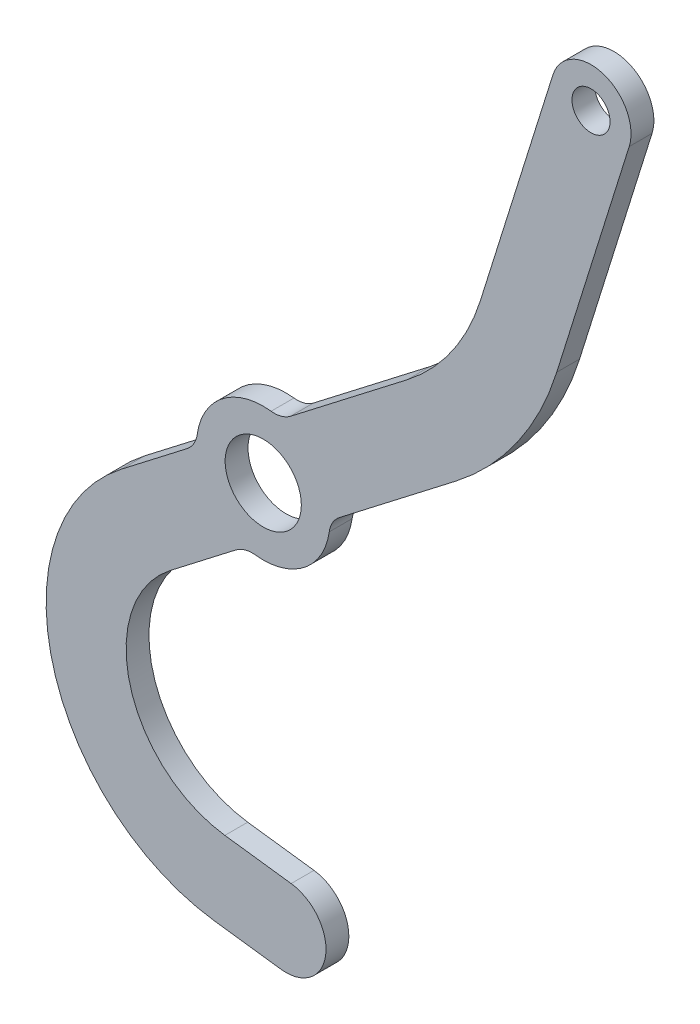
ISO-10303-21;
HEADER;
FILE_DESCRIPTION(('STEP AP214'),'2;1');
FILE_NAME('part.step','',(''),(''),'','','');
FILE_SCHEMA(('AUTOMOTIVE_DESIGN { 1 0 10303 214 1 1 1 1 }'));
ENDSEC;
DATA;
#1=APPLICATION_CONTEXT('core data for automotive mechanical design processes');
#2=APPLICATION_PROTOCOL_DEFINITION('international standard','automotive_design',2000,#1);
#3=PRODUCT_CONTEXT('',#1,'mechanical');
#4=PRODUCT('Part','Part','',(#3));
#5=PRODUCT_RELATED_PRODUCT_CATEGORY('part','',(#4));
#6=PRODUCT_DEFINITION_FORMATION('','',#4);
#7=PRODUCT_DEFINITION_CONTEXT('part definition',#1,'design');
#8=PRODUCT_DEFINITION('design','',#6,#7);
#9=PRODUCT_DEFINITION_SHAPE('','',#8);
#10=(LENGTH_UNIT() NAMED_UNIT(*) SI_UNIT(.MILLI.,.METRE.));
#11=(NAMED_UNIT(*) PLANE_ANGLE_UNIT() SI_UNIT($,.RADIAN.));
#12=(NAMED_UNIT(*) SI_UNIT($,.STERADIAN.) SOLID_ANGLE_UNIT());
#13=UNCERTAINTY_MEASURE_WITH_UNIT(LENGTH_MEASURE(1.E-05),#10,'distance_accuracy_value','');
#14=(GEOMETRIC_REPRESENTATION_CONTEXT(3) GLOBAL_UNCERTAINTY_ASSIGNED_CONTEXT((#13)) GLOBAL_UNIT_ASSIGNED_CONTEXT((#10,
#11,#12)) REPRESENTATION_CONTEXT('',''));
#15=CARTESIAN_POINT('',(0.,0.,0.));
#16=DIRECTION('',(0.,0.,1.));
#17=DIRECTION('',(1.,0.,0.));
#18=AXIS2_PLACEMENT_3D('',#15,#16,#17);
#19=CARTESIAN_POINT('',(33.4833613602103,43.6472773612829,5.78571428571429));
#20=DIRECTION('',(0.,0.,-1.));
#21=DIRECTION('',(-1.,0.,0.));
#22=AXIS2_PLACEMENT_3D('',#19,#20,#21);
#23=CYLINDRICAL_SURFACE('',#22,5.24999999999972);
#24=CARTESIAN_POINT('',(33.4833613602103,43.6472773612829,2.78571428571429));
#25=DIRECTION('',(0.,0.,1.));
#26=DIRECTION('',(-1.,0.,0.));
#27=AXIS2_PLACEMENT_3D('',#24,#25,#26);
#28=CIRCLE('',#27,5.24999999999972);
#29=CARTESIAN_POINT('',(38.4939702359269,42.0800190243824,2.78571428571429));
#30=VERTEX_POINT('',#29);
#31=CARTESIAN_POINT('',(28.4727524844932,45.2145356981836,2.78571428571429));
#32=VERTEX_POINT('',#31);
#33=EDGE_CURVE('E209',#30,#32,#28,.T.);
#34=ORIENTED_EDGE('',*,*,#33,.T.);
#35=DIRECTION('',(0.,0.,-1.));
#36=VECTOR('',#35,1.);
#37=CARTESIAN_POINT('',(28.4727524844932,45.2145356981836,5.78571428571429));
#38=LINE('',#37,#36);
#39=CARTESIAN_POINT('',(28.4727524844932,45.2145356981836,5.78571428571429));
#40=VERTEX_POINT('',#39);
#41=EDGE_CURVE('E11',#40,#32,#38,.T.);
#42=ORIENTED_EDGE('',*,*,#41,.F.);
#43=CARTESIAN_POINT('',(33.4833613602103,43.6472773612829,5.78571428571429));
#44=DIRECTION('',(0.,0.,1.));
#45=DIRECTION('',(-1.,0.,0.));
#46=AXIS2_PLACEMENT_3D('',#43,#44,#45);
#47=CIRCLE('',#46,5.24999999999972);
#48=CARTESIAN_POINT('',(38.4939702359269,42.0800190243824,5.78571428571429));
#49=VERTEX_POINT('',#48);
#50=EDGE_CURVE('E248',#49,#40,#47,.T.);
#51=ORIENTED_EDGE('',*,*,#50,.F.);
#52=DIRECTION('',(0.,0.,-1.));
#53=VECTOR('',#52,1.);
#54=CARTESIAN_POINT('',(38.4939702359269,42.0800190243824,5.78571428571429));
#55=LINE('',#54,#53);
#56=EDGE_CURVE('E205',#49,#30,#55,.T.);
#57=ORIENTED_EDGE('',*,*,#56,.T.);
#58=EDGE_LOOP('',(#34,#42,#51,#57));
#59=FACE_BOUND('',#58,.T.);
#60=ADVANCED_FACE('F41',(#59),#23,.T.);
#61=CARTESIAN_POINT('',(18.9598883272442,14.8013992946073,5.78571428571429));
#62=DIRECTION('',(0.954401690612786,-0.298525397504894,0.));
#63=DIRECTION('',(0.298525397504894,0.954401690612787,0.));
#64=AXIS2_PLACEMENT_3D('',#61,#62,#63);
#65=PLANE('',#64);
#66=DIRECTION('',(-0.298525397504894,-0.954401690612786,0.));
#67=VECTOR('',#66,1.);
#68=CARTESIAN_POINT('',(18.9598883272442,14.8013992946073,2.78571428571429));
#69=LINE('',#68,#67);
#70=CARTESIAN_POINT('',(18.9598883272442,14.8013992946073,2.78571428571429));
#71=VERTEX_POINT('',#70);
#72=EDGE_CURVE('E212',#32,#71,#69,.T.);
#73=ORIENTED_EDGE('',*,*,#72,.T.);
#74=DIRECTION('',(0.,0.,-1.));
#75=VECTOR('',#74,1.);
#76=CARTESIAN_POINT('',(18.9598883272442,14.8013992946073,5.78571428571429));
#77=LINE('',#76,#75);
#78=CARTESIAN_POINT('',(18.9598883272442,14.8013992946073,5.78571428571429));
#79=VERTEX_POINT('',#78);
#80=EDGE_CURVE('E49',#79,#71,#77,.T.);
#81=ORIENTED_EDGE('',*,*,#80,.F.);
#82=DIRECTION('',(-0.298525397504894,-0.954401690612786,0.));
#83=VECTOR('',#82,1.);
#84=CARTESIAN_POINT('',(18.9598883272442,14.8013992946073,5.78571428571429));
#85=LINE('',#84,#83);
#86=EDGE_CURVE('E136',#40,#79,#85,.T.);
#87=ORIENTED_EDGE('',*,*,#86,.F.);
#88=ORIENTED_EDGE('',*,*,#41,.T.);
#89=EDGE_LOOP('',(#73,#81,#87,#88));
#90=FACE_BOUND('',#89,.T.);
#91=ADVANCED_FACE('F367',(#90),#65,.F.);
#92=CARTESIAN_POINT('',(-7.76335900991444,23.1601104247448,5.78571428571429));
#93=DIRECTION('',(0.,0.,-1.));
#94=DIRECTION('',(-1.,0.,0.));
#95=AXIS2_PLACEMENT_3D('',#92,#93,#94);
#96=CYLINDRICAL_SURFACE('',#95,28.0000000000007);
#97=CARTESIAN_POINT('',(-7.76335900991444,23.1601104247448,2.78571428571429));
#98=DIRECTION('',(0.,0.,-1.));
#99=DIRECTION('',(-1.,0.,0.));
#100=AXIS2_PLACEMENT_3D('',#97,#98,#99);
#101=CIRCLE('',#100,28.0000000000007);
#102=CARTESIAN_POINT('',(9.33268393384769,0.985230139496725,2.78571428571429));
#103=VERTEX_POINT('',#102);
#104=EDGE_CURVE('E215',#71,#103,#101,.T.);
#105=ORIENTED_EDGE('',*,*,#104,.T.);
#106=DIRECTION('',(0.,0.,-1.));
#107=VECTOR('',#106,1.);
#108=CARTESIAN_POINT('',(9.33268393384769,0.985230139496725,5.78571428571429));
#109=LINE('',#108,#107);
#110=CARTESIAN_POINT('',(9.33268393384769,0.985230139496725,5.78571428571429));
#111=VERTEX_POINT('',#110);
#112=EDGE_CURVE('E291',#111,#103,#109,.T.);
#113=ORIENTED_EDGE('',*,*,#112,.F.);
#114=CARTESIAN_POINT('',(-7.76335900991444,23.1601104247448,5.78571428571429));
#115=DIRECTION('',(0.,0.,-1.));
#116=DIRECTION('',(-1.,0.,0.));
#117=AXIS2_PLACEMENT_3D('',#114,#115,#116);
#118=CIRCLE('',#117,28.0000000000007);
#119=EDGE_CURVE('E299',#79,#111,#118,.T.);
#120=ORIENTED_EDGE('',*,*,#119,.F.);
#121=ORIENTED_EDGE('',*,*,#80,.T.);
#122=EDGE_LOOP('',(#105,#113,#120,#121));
#123=FACE_BOUND('',#122,.T.);
#124=ADVANCED_FACE('F297',(#123),#96,.F.);
#125=CARTESIAN_POINT('',(9.33268393384769,0.985230139496725,5.78571428571429));
#126=DIRECTION('',(0.610572962277197,-0.791960010187414,0.));
#127=DIRECTION('',(0.791960010187414,0.610572962277197,0.));
#128=AXIS2_PLACEMENT_3D('',#125,#126,#127);
#129=PLANE('',#128);
#130=DIRECTION('',(-0.791960010187414,-0.610572962277197,0.));
#131=VECTOR('',#130,1.);
#132=CARTESIAN_POINT('',(9.33268393384769,0.985230139496725,2.78571428571429));
#133=LINE('',#132,#131);
#134=CARTESIAN_POINT('',(-5.96819056035097,-10.8111991564013,2.78571428571429));
#135=VERTEX_POINT('',#134);
#136=EDGE_CURVE('E217',#103,#135,#133,.T.);
#137=ORIENTED_EDGE('',*,*,#136,.T.);
#138=DIRECTION('',(0.,0.,-1.));
#139=VECTOR('',#138,1.);
#140=CARTESIAN_POINT('',(-5.96819056035097,-10.8111991564013,5.78571428571429));
#141=LINE('',#140,#139);
#142=CARTESIAN_POINT('',(-5.96819056035097,-10.8111991564013,5.78571428571429));
#143=VERTEX_POINT('',#142);
#144=EDGE_CURVE('E288',#143,#135,#141,.T.);
#145=ORIENTED_EDGE('',*,*,#144,.F.);
#146=DIRECTION('',(-0.791960010187414,-0.610572962277197,0.));
#147=VECTOR('',#146,1.);
#148=CARTESIAN_POINT('',(9.33268393384769,0.985230139496725,5.78571428571429));
#149=LINE('',#148,#147);
#150=EDGE_CURVE('E317',#111,#143,#149,.T.);
#151=ORIENTED_EDGE('',*,*,#150,.F.);
#152=ORIENTED_EDGE('',*,*,#112,.T.);
#153=EDGE_LOOP('',(#137,#145,#151,#152));
#154=FACE_BOUND('',#153,.T.);
#155=ADVANCED_FACE('F308',(#154),#129,.F.);
#156=CARTESIAN_POINT('',(-8.10519592832123,-8.03933912074519,5.78571428571429));
#157=DIRECTION('',(0.,0.,-1.));
#158=DIRECTION('',(-1.,0.,0.));
#159=AXIS2_PLACEMENT_3D('',#156,#157,#158);
#160=CYLINDRICAL_SURFACE('',#159,3.50000000000015);
#161=CARTESIAN_POINT('',(-8.10519592832123,-8.03933912074519,2.78571428571429));
#162=DIRECTION('',(0.,0.,-1.));
#163=DIRECTION('',(-1.,0.,0.));
#164=AXIS2_PLACEMENT_3D('',#161,#162,#163);
#165=CIRCLE('',#164,3.50000000000015);
#166=CARTESIAN_POINT('',(-8.51866144427671,-11.5148313545326,2.78571428571429));
#167=VERTEX_POINT('',#166);
#168=EDGE_CURVE('E219',#135,#167,#165,.T.);
#169=ORIENTED_EDGE('',*,*,#168,.T.);
#170=DIRECTION('',(0.,0.,-1.));
#171=VECTOR('',#170,1.);
#172=CARTESIAN_POINT('',(-8.51866144427671,-11.5148313545326,5.78571428571429));
#173=LINE('',#172,#171);
#174=CARTESIAN_POINT('',(-8.51866144427671,-11.5148313545326,5.78571428571429));
#175=VERTEX_POINT('',#174);
#176=EDGE_CURVE('E285',#175,#167,#173,.T.);
#177=ORIENTED_EDGE('',*,*,#176,.F.);
#178=CARTESIAN_POINT('',(-8.10519592832123,-8.03933912074519,5.78571428571429));
#179=DIRECTION('',(0.,0.,-1.));
#180=DIRECTION('',(-1.,0.,0.));
#181=AXIS2_PLACEMENT_3D('',#178,#179,#180);
#182=CIRCLE('',#181,3.50000000000015);
#183=EDGE_CURVE('E314',#143,#175,#182,.T.);
#184=ORIENTED_EDGE('',*,*,#183,.F.);
#185=ORIENTED_EDGE('',*,*,#144,.T.);
#186=EDGE_LOOP('',(#169,#177,#184,#185));
#187=FACE_BOUND('',#186,.T.);
#188=ADVANCED_FACE('F312',(#187),#160,.F.);
#189=CARTESIAN_POINT('',(-9.55232523416558,-20.2035619390008,5.78571428571429));
#190=DIRECTION('',(0.,0.,-1.));
#191=DIRECTION('',(-1.,0.,0.));
#192=AXIS2_PLACEMENT_3D('',#189,#190,#191);
#193=CYLINDRICAL_SURFACE('',#192,8.75);
#194=CARTESIAN_POINT('',(-9.55232523416558,-20.2035619390008,2.78571428571429));
#195=DIRECTION('',(0.,0.,1.));
#196=DIRECTION('',(1.,0.,0.));
#197=AXIS2_PLACEMENT_3D('',#194,#195,#196);
#198=CIRCLE('',#197,8.75);
#199=CARTESIAN_POINT('',(-18.2181510525194,-18.9927923961263,2.78571428571429));
#200=VERTEX_POINT('',#199);
#201=EDGE_CURVE('E221',#167,#200,#198,.T.);
#202=ORIENTED_EDGE('',*,*,#201,.T.);
#203=DIRECTION('',(0.,0.,-1.));
#204=VECTOR('',#203,1.);
#205=CARTESIAN_POINT('',(-18.2181510525194,-18.9927923961263,5.78571428571429));
#206=LINE('',#205,#204);
#207=CARTESIAN_POINT('',(-18.2181510525194,-18.9927923961263,5.78571428571429));
#208=VERTEX_POINT('',#207);
#209=EDGE_CURVE('E282',#208,#200,#206,.T.);
#210=ORIENTED_EDGE('',*,*,#209,.F.);
#211=CARTESIAN_POINT('',(-9.55232523416558,-20.2035619390008,5.78571428571429));
#212=DIRECTION('',(0.,0.,1.));
#213=DIRECTION('',(1.,0.,0.));
#214=AXIS2_PLACEMENT_3D('',#211,#212,#213);
#215=CIRCLE('',#214,8.75);
#216=EDGE_CURVE('E316',#175,#208,#215,.T.);
#217=ORIENTED_EDGE('',*,*,#216,.F.);
#218=ORIENTED_EDGE('',*,*,#176,.T.);
#219=EDGE_LOOP('',(#202,#210,#217,#218));
#220=FACE_BOUND('',#219,.T.);
#221=ADVANCED_FACE('F380',(#220),#193,.T.);
#222=CARTESIAN_POINT('',(-21.6844813798609,-18.5084845789765,5.78571428571429));
#223=DIRECTION('',(0.,0.,-1.));
#224=DIRECTION('',(-1.,0.,0.));
#225=AXIS2_PLACEMENT_3D('',#222,#223,#224);
#226=CYLINDRICAL_SURFACE('',#225,3.49999999999996);
#227=CARTESIAN_POINT('',(-21.6844813798609,-18.5084845789765,2.78571428571429));
#228=DIRECTION('',(0.,0.,-1.));
#229=DIRECTION('',(-1.,0.,0.));
#230=AXIS2_PLACEMENT_3D('',#227,#228,#229);
#231=CIRCLE('',#230,3.49999999999996);
#232=CARTESIAN_POINT('',(-19.5474760118907,-21.2803446146324,2.78571428571429));
#233=VERTEX_POINT('',#232);
#234=EDGE_CURVE('E223',#200,#233,#231,.T.);
#235=ORIENTED_EDGE('',*,*,#234,.T.);
#236=DIRECTION('',(0.,0.,-1.));
#237=VECTOR('',#236,1.);
#238=CARTESIAN_POINT('',(-19.5474760118907,-21.2803446146324,5.78571428571429));
#239=LINE('',#238,#237);
#240=CARTESIAN_POINT('',(-19.5474760118907,-21.2803446146324,5.78571428571429));
#241=VERTEX_POINT('',#240);
#242=EDGE_CURVE('E279',#241,#233,#239,.T.);
#243=ORIENTED_EDGE('',*,*,#242,.F.);
#244=CARTESIAN_POINT('',(-21.6844813798609,-18.5084845789765,5.78571428571429));
#245=DIRECTION('',(0.,0.,-1.));
#246=DIRECTION('',(-1.,0.,0.));
#247=AXIS2_PLACEMENT_3D('',#244,#245,#246);
#248=CIRCLE('',#247,3.49999999999996);
#249=EDGE_CURVE('E319',#208,#241,#248,.T.);
#250=ORIENTED_EDGE('',*,*,#249,.F.);
#251=ORIENTED_EDGE('',*,*,#209,.T.);
#252=EDGE_LOOP('',(#235,#243,#250,#251));
#253=FACE_BOUND('',#252,.T.);
#254=ADVANCED_FACE('F383',(#253),#226,.F.);
#255=CARTESIAN_POINT('',(-19.5474760118907,-21.2803446146324,5.78571428571429));
#256=DIRECTION('',(0.610572962277196,-0.791960010187414,0.));
#257=DIRECTION('',(0.791960010187414,0.610572962277196,0.));
#258=AXIS2_PLACEMENT_3D('',#255,#256,#257);
#259=PLANE('',#258);
#260=DIRECTION('',(-0.791960010187414,-0.610572962277196,0.));
#261=VECTOR('',#260,1.);
#262=CARTESIAN_POINT('',(-19.5474760118907,-21.2803446146324,2.78571428571429));
#263=LINE('',#262,#261);
#264=CARTESIAN_POINT('',(-28.1753314382753,-27.9321138681587,2.78571428571429));
#265=VERTEX_POINT('',#264);
#266=EDGE_CURVE('E225',#233,#265,#263,.T.);
#267=ORIENTED_EDGE('',*,*,#266,.T.);
#268=DIRECTION('',(0.,0.,-1.));
#269=VECTOR('',#268,1.);
#270=CARTESIAN_POINT('',(-28.1753314382753,-27.9321138681587,5.78571428571429));
#271=LINE('',#270,#269);
#272=CARTESIAN_POINT('',(-28.1753314382753,-27.9321138681587,5.78571428571429));
#273=VERTEX_POINT('',#272);
#274=EDGE_CURVE('E276',#273,#265,#271,.T.);
#275=ORIENTED_EDGE('',*,*,#274,.F.);
#276=DIRECTION('',(-0.791960010187414,-0.610572962277196,0.));
#277=VECTOR('',#276,1.);
#278=CARTESIAN_POINT('',(-19.5474760118907,-21.2803446146324,5.78571428571429));
#279=LINE('',#278,#277);
#280=EDGE_CURVE('E325',#241,#273,#279,.T.);
#281=ORIENTED_EDGE('',*,*,#280,.F.);
#282=ORIENTED_EDGE('',*,*,#242,.T.);
#283=EDGE_LOOP('',(#267,#275,#281,#282));
#284=FACE_BOUND('',#283,.T.);
#285=ADVANCED_FACE('F387',(#284),#259,.F.);
#286=CARTESIAN_POINT('',(-12.6820425204914,-48.0280991266644,5.78571428571429));
#287=DIRECTION('',(0.,0.,-1.));
#288=DIRECTION('',(-1.,0.,0.));
#289=AXIS2_PLACEMENT_3D('',#286,#287,#288);
#290=CYLINDRICAL_SURFACE('',#289,25.375);
#291=CARTESIAN_POINT('',(-12.6820425204914,-48.0280991266644,2.78571428571429));
#292=DIRECTION('',(0.,0.,1.));
#293=DIRECTION('',(1.,0.,0.));
#294=AXIS2_PLACEMENT_3D('',#291,#292,#293);
#295=CIRCLE('',#294,25.375);
#296=CARTESIAN_POINT('',(-15.9366403147583,-73.1935162342259,2.78571428571429));
#297=VERTEX_POINT('',#296);
#298=EDGE_CURVE('E227',#265,#297,#295,.T.);
#299=ORIENTED_EDGE('',*,*,#298,.T.);
#300=DIRECTION('',(0.,0.,-1.));
#301=VECTOR('',#300,1.);
#302=CARTESIAN_POINT('',(-15.9366403147583,-73.1935162342259,5.78571428571429));
#303=LINE('',#302,#301);
#304=CARTESIAN_POINT('',(-15.9366403147583,-73.1935162342259,5.78571428571429));
#305=VERTEX_POINT('',#304);
#306=EDGE_CURVE('E273',#305,#297,#303,.T.);
#307=ORIENTED_EDGE('',*,*,#306,.F.);
#308=CARTESIAN_POINT('',(-12.6820425204914,-48.0280991266644,5.78571428571429));
#309=DIRECTION('',(0.,0.,1.));
#310=DIRECTION('',(1.,0.,0.));
#311=AXIS2_PLACEMENT_3D('',#308,#309,#310);
#312=CIRCLE('',#311,25.375);
#313=EDGE_CURVE('E327',#273,#305,#312,.T.);
#314=ORIENTED_EDGE('',*,*,#313,.F.);
#315=ORIENTED_EDGE('',*,*,#274,.T.);
#316=EDGE_LOOP('',(#299,#307,#314,#315));
#317=FACE_BOUND('',#316,.T.);
#318=ADVANCED_FACE('F391',(#317),#290,.T.);
#319=CARTESIAN_POINT('',(-15.9366403147583,-73.1935162342259,5.78571428571429));
#320=DIRECTION('',(0.128260011596723,0.991740575667452,0.));
#321=DIRECTION('',(-0.991740575667452,0.128260011596723,0.));
#322=AXIS2_PLACEMENT_3D('',#319,#320,#321);
#323=PLANE('',#322);
#324=DIRECTION('',(0.991740575667452,-0.128260011596723,0.));
#325=VECTOR('',#324,1.);
#326=CARTESIAN_POINT('',(-15.9366403147583,-73.1935162342259,2.78571428571429));
#327=LINE('',#326,#325);
#328=CARTESIAN_POINT('',(-7.23519131639605,-74.3188588659793,2.78571428571429));
#329=VERTEX_POINT('',#328);
#330=EDGE_CURVE('E229',#297,#329,#327,.T.);
#331=ORIENTED_EDGE('',*,*,#330,.T.);
#332=DIRECTION('',(0.,0.,-1.));
#333=VECTOR('',#332,1.);
#334=CARTESIAN_POINT('',(-7.23519131639605,-74.3188588659793,5.78571428571429));
#335=LINE('',#334,#333);
#336=CARTESIAN_POINT('',(-7.23519131639605,-74.3188588659793,5.78571428571429));
#337=VERTEX_POINT('',#336);
#338=EDGE_CURVE('E270',#337,#329,#335,.T.);
#339=ORIENTED_EDGE('',*,*,#338,.F.);
#340=DIRECTION('',(0.991740575667452,-0.128260011596723,0.));
#341=VECTOR('',#340,1.);
#342=CARTESIAN_POINT('',(-15.9366403147583,-73.1935162342259,5.78571428571429));
#343=LINE('',#342,#341);
#344=EDGE_CURVE('E329',#305,#337,#343,.T.);
#345=ORIENTED_EDGE('',*,*,#344,.F.);
#346=ORIENTED_EDGE('',*,*,#306,.T.);
#347=EDGE_LOOP('',(#331,#339,#345,#346));
#348=FACE_BOUND('',#347,.T.);
#349=ADVANCED_FACE('F395',(#348),#323,.F.);
#350=CARTESIAN_POINT('',(-6.56182625551326,-69.1122208437252,5.78571428571429));
#351=DIRECTION('',(0.,0.,-1.));
#352=DIRECTION('',(-1.,0.,0.));
#353=AXIS2_PLACEMENT_3D('',#350,#351,#352);
#354=CYLINDRICAL_SURFACE('',#353,5.24999999999998);
#355=CARTESIAN_POINT('',(-6.56182625551326,-69.1122208437252,2.78571428571429));
#356=DIRECTION('',(0.,0.,1.));
#357=DIRECTION('',(-1.,0.,0.));
#358=AXIS2_PLACEMENT_3D('',#355,#356,#357);
#359=CIRCLE('',#358,5.24999999999998);
#360=CARTESIAN_POINT('',(-5.88846119463047,-63.9055828214711,2.78571428571429));
#361=VERTEX_POINT('',#360);
#362=EDGE_CURVE('E231',#329,#361,#359,.T.);
#363=ORIENTED_EDGE('',*,*,#362,.T.);
#364=DIRECTION('',(0.,0.,-1.));
#365=VECTOR('',#364,1.);
#366=CARTESIAN_POINT('',(-5.88846119463047,-63.9055828214711,5.78571428571429));
#367=LINE('',#366,#365);
#368=CARTESIAN_POINT('',(-5.88846119463047,-63.9055828214711,5.78571428571429));
#369=VERTEX_POINT('',#368);
#370=EDGE_CURVE('E267',#369,#361,#367,.T.);
#371=ORIENTED_EDGE('',*,*,#370,.F.);
#372=CARTESIAN_POINT('',(-6.56182625551326,-69.1122208437252,5.78571428571429));
#373=DIRECTION('',(0.,0.,1.));
#374=DIRECTION('',(-1.,0.,0.));
#375=AXIS2_PLACEMENT_3D('',#372,#373,#374);
#376=CIRCLE('',#375,5.24999999999998);
#377=EDGE_CURVE('E331',#337,#369,#376,.T.);
#378=ORIENTED_EDGE('',*,*,#377,.F.);
#379=ORIENTED_EDGE('',*,*,#338,.T.);
#380=EDGE_LOOP('',(#363,#371,#378,#379));
#381=FACE_BOUND('',#380,.T.);
#382=ADVANCED_FACE('F399',(#381),#354,.T.);
#383=CARTESIAN_POINT('',(-14.5899101929927,-62.7802401897177,5.78571428571429));
#384=DIRECTION('',(-0.128260011596723,-0.991740575667452,0.));
#385=DIRECTION('',(0.991740575667452,-0.128260011596723,0.));
#386=AXIS2_PLACEMENT_3D('',#383,#384,#385);
#387=PLANE('',#386);
#388=DIRECTION('',(-0.991740575667452,0.128260011596723,0.));
#389=VECTOR('',#388,1.);
#390=CARTESIAN_POINT('',(-14.5899101929927,-62.7802401897177,2.78571428571429));
#391=LINE('',#390,#389);
#392=CARTESIAN_POINT('',(-14.5899101929927,-62.7802401897177,2.78571428571429));
#393=VERTEX_POINT('',#392);
#394=EDGE_CURVE('E233',#361,#393,#391,.T.);
#395=ORIENTED_EDGE('',*,*,#394,.T.);
#396=DIRECTION('',(0.,0.,-1.));
#397=VECTOR('',#396,1.);
#398=CARTESIAN_POINT('',(-14.5899101929927,-62.7802401897177,5.78571428571429));
#399=LINE('',#398,#397);
#400=CARTESIAN_POINT('',(-14.5899101929927,-62.7802401897177,5.78571428571429));
#401=VERTEX_POINT('',#400);
#402=EDGE_CURVE('E264',#401,#393,#399,.T.);
#403=ORIENTED_EDGE('',*,*,#402,.F.);
#404=DIRECTION('',(-0.991740575667452,0.128260011596723,0.));
#405=VECTOR('',#404,1.);
#406=CARTESIAN_POINT('',(-14.5899101929927,-62.7802401897177,5.78571428571429));
#407=LINE('',#406,#405);
#408=EDGE_CURVE('E333',#369,#401,#407,.T.);
#409=ORIENTED_EDGE('',*,*,#408,.F.);
#410=ORIENTED_EDGE('',*,*,#370,.T.);
#411=EDGE_LOOP('',(#395,#403,#409,#410));
#412=FACE_BOUND('',#411,.T.);
#413=ADVANCED_FACE('F403',(#412),#387,.F.);
#414=CARTESIAN_POINT('',(-12.6820425204914,-48.0280991266644,5.78571428571429));
#415=DIRECTION('',(0.,0.,-1.));
#416=DIRECTION('',(-1.,0.,0.));
#417=AXIS2_PLACEMENT_3D('',#414,#415,#416);
#418=CYLINDRICAL_SURFACE('',#417,14.875);
#419=CARTESIAN_POINT('',(-12.6820425204914,-48.0280991266644,2.78571428571429));
#420=DIRECTION('',(0.,0.,-1.));
#421=DIRECTION('',(1.,0.,0.));
#422=AXIS2_PLACEMENT_3D('',#419,#420,#421);
#423=CIRCLE('',#422,14.875);
#424=CARTESIAN_POINT('',(-21.7643153343649,-36.2476939751267,2.78571428571429));
#425=VERTEX_POINT('',#424);
#426=EDGE_CURVE('E235',#393,#425,#423,.T.);
#427=ORIENTED_EDGE('',*,*,#426,.T.);
#428=DIRECTION('',(0.,0.,-1.));
#429=VECTOR('',#428,1.);
#430=CARTESIAN_POINT('',(-21.7643153343649,-36.2476939751267,5.78571428571429));
#431=LINE('',#430,#429);
#432=CARTESIAN_POINT('',(-21.7643153343649,-36.2476939751267,5.78571428571429));
#433=VERTEX_POINT('',#432);
#434=EDGE_CURVE('E261',#433,#425,#431,.T.);
#435=ORIENTED_EDGE('',*,*,#434,.F.);
#436=CARTESIAN_POINT('',(-12.6820425204914,-48.0280991266644,5.78571428571429));
#437=DIRECTION('',(0.,0.,-1.));
#438=DIRECTION('',(1.,0.,0.));
#439=AXIS2_PLACEMENT_3D('',#436,#437,#438);
#440=CIRCLE('',#439,14.875);
#441=EDGE_CURVE('E335',#401,#433,#440,.T.);
#442=ORIENTED_EDGE('',*,*,#441,.F.);
#443=ORIENTED_EDGE('',*,*,#402,.T.);
#444=EDGE_LOOP('',(#427,#435,#442,#443));
#445=FACE_BOUND('',#444,.T.);
#446=ADVANCED_FACE('F407',(#445),#418,.F.);
#447=CARTESIAN_POINT('',(-13.1364599079803,-29.5959247216003,5.78571428571429));
#448=DIRECTION('',(-0.610572962277201,0.791960010187411,0.));
#449=DIRECTION('',(-0.791960010187411,-0.6105729622772,0.));
#450=AXIS2_PLACEMENT_3D('',#447,#448,#449);
#451=PLANE('',#450);
#452=DIRECTION('',(0.791960010187411,0.6105729622772,0.));
#453=VECTOR('',#452,1.);
#454=CARTESIAN_POINT('',(-13.1364599079803,-29.5959247216003,2.78571428571429));
#455=LINE('',#454,#453);
#456=CARTESIAN_POINT('',(-13.1364599079803,-29.5959247216004,2.78571428571429));
#457=VERTEX_POINT('',#456);
#458=EDGE_CURVE('E237',#425,#457,#455,.T.);
#459=ORIENTED_EDGE('',*,*,#458,.T.);
#460=DIRECTION('',(0.,0.,-1.));
#461=VECTOR('',#460,1.);
#462=CARTESIAN_POINT('',(-13.1364599079803,-29.5959247216004,5.78571428571429));
#463=LINE('',#462,#461);
#464=CARTESIAN_POINT('',(-13.1364599079803,-29.5959247216004,5.78571428571429));
#465=VERTEX_POINT('',#464);
#466=EDGE_CURVE('E258',#465,#457,#463,.T.);
#467=ORIENTED_EDGE('',*,*,#466,.F.);
#468=DIRECTION('',(0.791960010187411,0.6105729622772,0.));
#469=VECTOR('',#468,1.);
#470=CARTESIAN_POINT('',(-13.1364599079803,-29.5959247216003,5.78571428571429));
#471=LINE('',#470,#469);
#472=EDGE_CURVE('E337',#433,#465,#471,.T.);
#473=ORIENTED_EDGE('',*,*,#472,.F.);
#474=ORIENTED_EDGE('',*,*,#434,.T.);
#475=EDGE_LOOP('',(#459,#467,#473,#474));
#476=FACE_BOUND('',#475,.T.);
#477=ADVANCED_FACE('F411',(#476),#451,.F.);
#478=CARTESIAN_POINT('',(-10.9994545400099,-32.3677847572562,5.78571428571429));
#479=DIRECTION('',(0.,0.,-1.));
#480=DIRECTION('',(-1.,0.,0.));
#481=AXIS2_PLACEMENT_3D('',#478,#479,#480);
#482=CYLINDRICAL_SURFACE('',#481,3.50000000000005);
#483=CARTESIAN_POINT('',(-10.9994545400099,-32.3677847572562,2.78571428571429));
#484=DIRECTION('',(0.,0.,-1.));
#485=DIRECTION('',(1.,0.,0.));
#486=AXIS2_PLACEMENT_3D('',#483,#484,#485);
#487=CIRCLE('',#486,3.50000000000005);
#488=CARTESIAN_POINT('',(-10.5859890240546,-28.8922925234688,2.78571428571429));
#489=VERTEX_POINT('',#488);
#490=EDGE_CURVE('E239',#457,#489,#487,.T.);
#491=ORIENTED_EDGE('',*,*,#490,.T.);
#492=DIRECTION('',(0.,0.,-1.));
#493=VECTOR('',#492,1.);
#494=CARTESIAN_POINT('',(-10.5859890240546,-28.8922925234688,5.78571428571429));
#495=LINE('',#494,#493);
#496=CARTESIAN_POINT('',(-10.5859890240546,-28.8922925234688,5.78571428571429));
#497=VERTEX_POINT('',#496);
#498=EDGE_CURVE('E255',#497,#489,#495,.T.);
#499=ORIENTED_EDGE('',*,*,#498,.F.);
#500=CARTESIAN_POINT('',(-10.9994545400099,-32.3677847572562,5.78571428571429));
#501=DIRECTION('',(0.,0.,-1.));
#502=DIRECTION('',(1.,0.,0.));
#503=AXIS2_PLACEMENT_3D('',#500,#501,#502);
#504=CIRCLE('',#503,3.50000000000005);
#505=EDGE_CURVE('E339',#465,#497,#504,.T.);
#506=ORIENTED_EDGE('',*,*,#505,.F.);
#507=ORIENTED_EDGE('',*,*,#466,.T.);
#508=EDGE_LOOP('',(#491,#499,#506,#507));
#509=FACE_BOUND('',#508,.T.);
#510=ADVANCED_FACE('F415',(#509),#482,.F.);
#511=CARTESIAN_POINT('',(-9.55232523416563,-20.2035619390007,5.78571428571429));
#512=DIRECTION('',(0.,0.,-1.));
#513=DIRECTION('',(-1.,0.,0.));
#514=AXIS2_PLACEMENT_3D('',#511,#512,#513);
#515=CYLINDRICAL_SURFACE('',#514,8.74999999999997);
#516=CARTESIAN_POINT('',(-9.55232523416563,-20.2035619390007,2.78571428571429));
#517=DIRECTION('',(0.,0.,1.));
#518=DIRECTION('',(-1.,0.,0.));
#519=AXIS2_PLACEMENT_3D('',#516,#517,#518);
#520=CIRCLE('',#519,8.74999999999997);
#521=CARTESIAN_POINT('',(-0.886499415811958,-21.4143314818753,2.78571428571429));
#522=VERTEX_POINT('',#521);
#523=EDGE_CURVE('E241',#489,#522,#520,.T.);
#524=ORIENTED_EDGE('',*,*,#523,.T.);
#525=DIRECTION('',(0.,0.,-1.));
#526=VECTOR('',#525,1.);
#527=CARTESIAN_POINT('',(-0.886499415811958,-21.4143314818753,5.78571428571429));
#528=LINE('',#527,#526);
#529=CARTESIAN_POINT('',(-0.886499415811958,-21.4143314818753,5.78571428571429));
#530=VERTEX_POINT('',#529);
#531=EDGE_CURVE('E252',#530,#522,#528,.T.);
#532=ORIENTED_EDGE('',*,*,#531,.F.);
#533=CARTESIAN_POINT('',(-9.55232523416563,-20.2035619390007,5.78571428571429));
#534=DIRECTION('',(0.,0.,1.));
#535=DIRECTION('',(-1.,0.,0.));
#536=AXIS2_PLACEMENT_3D('',#533,#534,#535);
#537=CIRCLE('',#536,8.74999999999997);
#538=EDGE_CURVE('E341',#497,#530,#537,.T.);
#539=ORIENTED_EDGE('',*,*,#538,.F.);
#540=ORIENTED_EDGE('',*,*,#498,.T.);
#541=EDGE_LOOP('',(#524,#532,#539,#540));
#542=FACE_BOUND('',#541,.T.);
#543=ADVANCED_FACE('F347',(#542),#515,.T.);
#544=CARTESIAN_POINT('',(2.57983091152979,-21.8986392990251,5.78571428571429));
#545=DIRECTION('',(0.,0.,-1.));
#546=DIRECTION('',(-1.,0.,0.));
#547=AXIS2_PLACEMENT_3D('',#544,#545,#546);
#548=CYLINDRICAL_SURFACE('',#547,3.50000000000023);
#549=CARTESIAN_POINT('',(2.57983091152979,-21.8986392990251,2.78571428571429));
#550=DIRECTION('',(0.,0.,-1.));
#551=DIRECTION('',(1.,0.,0.));
#552=AXIS2_PLACEMENT_3D('',#549,#550,#551);
#553=CIRCLE('',#552,3.50000000000023);
#554=CARTESIAN_POINT('',(0.442825543559347,-19.1267792633691,2.78571428571429));
#555=VERTEX_POINT('',#554);
#556=EDGE_CURVE('E243',#522,#555,#553,.T.);
#557=ORIENTED_EDGE('',*,*,#556,.T.);
#558=DIRECTION('',(0.,0.,-1.));
#559=VECTOR('',#558,1.);
#560=CARTESIAN_POINT('',(0.442825543559347,-19.1267792633691,5.78571428571429));
#561=LINE('',#560,#559);
#562=CARTESIAN_POINT('',(0.442825543559347,-19.1267792633691,5.78571428571429));
#563=VERTEX_POINT('',#562);
#564=EDGE_CURVE('E200',#563,#555,#561,.T.);
#565=ORIENTED_EDGE('',*,*,#564,.F.);
#566=CARTESIAN_POINT('',(2.57983091152979,-21.8986392990251,5.78571428571429));
#567=DIRECTION('',(0.,0.,-1.));
#568=DIRECTION('',(1.,0.,0.));
#569=AXIS2_PLACEMENT_3D('',#566,#567,#568);
#570=CIRCLE('',#569,3.50000000000023);
#571=EDGE_CURVE('E191',#530,#563,#570,.T.);
#572=ORIENTED_EDGE('',*,*,#571,.F.);
#573=ORIENTED_EDGE('',*,*,#531,.T.);
#574=EDGE_LOOP('',(#557,#565,#572,#573));
#575=FACE_BOUND('',#574,.T.);
#576=ADVANCED_FACE('F351',(#575),#548,.F.);
#577=CARTESIAN_POINT('',(15.7437000377582,-7.33034996747085,5.78571428571429));
#578=DIRECTION('',(-0.6105729622772,0.791960010187412,0.));
#579=DIRECTION('',(-0.791960010187412,-0.6105729622772,0.));
#580=AXIS2_PLACEMENT_3D('',#577,#578,#579);
#581=PLANE('',#580);
#582=DIRECTION('',(0.791960010187412,0.6105729622772,0.));
#583=VECTOR('',#582,1.);
#584=CARTESIAN_POINT('',(15.7437000377582,-7.33034996747085,2.78571428571429));
#585=LINE('',#584,#583);
#586=CARTESIAN_POINT('',(15.7437000377582,-7.33034996747078,2.78571428571429));
#587=VERTEX_POINT('',#586);
#588=EDGE_CURVE('E199',#555,#587,#585,.T.);
#589=ORIENTED_EDGE('',*,*,#588,.T.);
#590=DIRECTION('',(0.,0.,-1.));
#591=VECTOR('',#590,1.);
#592=CARTESIAN_POINT('',(15.7437000377582,-7.33034996747078,5.78571428571429));
#593=LINE('',#592,#591);
#594=CARTESIAN_POINT('',(15.7437000377582,-7.33034996747078,5.78571428571429));
#595=VERTEX_POINT('',#594);
#596=EDGE_CURVE('E196',#595,#587,#593,.T.);
#597=ORIENTED_EDGE('',*,*,#596,.F.);
#598=DIRECTION('',(0.791960010187412,0.6105729622772,0.));
#599=VECTOR('',#598,1.);
#600=CARTESIAN_POINT('',(15.7437000377582,-7.33034996747085,5.78571428571429));
#601=LINE('',#600,#599);
#602=EDGE_CURVE('E185',#563,#595,#601,.T.);
#603=ORIENTED_EDGE('',*,*,#602,.F.);
#604=ORIENTED_EDGE('',*,*,#564,.T.);
#605=EDGE_LOOP('',(#589,#597,#603,#604));
#606=FACE_BOUND('',#605,.T.);
#607=ADVANCED_FACE('F197',(#606),#581,.F.);
#608=CARTESIAN_POINT('',(-7.76335900991298,23.1601104247437,5.78571428571429));
#609=DIRECTION('',(0.,0.,-1.));
#610=DIRECTION('',(-1.,0.,0.));
#611=AXIS2_PLACEMENT_3D('',#608,#609,#610);
#612=CYLINDRICAL_SURFACE('',#611,38.4999999999987);
#613=CARTESIAN_POINT('',(-7.76335900991298,23.1601104247437,2.78571428571429));
#614=DIRECTION('',(0.,0.,1.));
#615=DIRECTION('',(-1.,0.,0.));
#616=AXIS2_PLACEMENT_3D('',#613,#614,#615);
#617=CIRCLE('',#616,38.4999999999987);
#618=CARTESIAN_POINT('',(28.981106078678,11.6668826208057,2.78571428571429));
#619=VERTEX_POINT('',#618);
#620=EDGE_CURVE('E122',#587,#619,#617,.T.);
#621=ORIENTED_EDGE('',*,*,#620,.T.);
#622=DIRECTION('',(0.,0.,-1.));
#623=VECTOR('',#622,1.);
#624=CARTESIAN_POINT('',(28.981106078678,11.6668826208057,5.78571428571429));
#625=LINE('',#624,#623);
#626=CARTESIAN_POINT('',(28.981106078678,11.6668826208057,5.78571428571429));
#627=VERTEX_POINT('',#626);
#628=EDGE_CURVE('E201',#627,#619,#625,.T.);
#629=ORIENTED_EDGE('',*,*,#628,.F.);
#630=CARTESIAN_POINT('',(-7.76335900991298,23.1601104247437,5.78571428571429));
#631=DIRECTION('',(0.,0.,1.));
#632=DIRECTION('',(-1.,0.,0.));
#633=AXIS2_PLACEMENT_3D('',#630,#631,#632);
#634=CIRCLE('',#633,38.4999999999987);
#635=EDGE_CURVE('E189',#595,#627,#634,.T.);
#636=ORIENTED_EDGE('',*,*,#635,.F.);
#637=ORIENTED_EDGE('',*,*,#596,.T.);
#638=EDGE_LOOP('',(#621,#629,#636,#637));
#639=FACE_BOUND('',#638,.T.);
#640=ADVANCED_FACE('F203',(#639),#612,.T.);
#641=CARTESIAN_POINT('',(38.4939702359269,42.0800190243824,5.78571428571429));
#642=DIRECTION('',(-0.954401690612788,0.29852539750489,0.));
#643=DIRECTION('',(-0.29852539750489,-0.954401690612788,0.));
#644=AXIS2_PLACEMENT_3D('',#641,#642,#643);
#645=PLANE('',#644);
#646=DIRECTION('',(0.29852539750489,0.954401690612788,0.));
#647=VECTOR('',#646,1.);
#648=CARTESIAN_POINT('',(38.4939702359269,42.0800190243824,2.78571428571429));
#649=LINE('',#648,#647);
#650=EDGE_CURVE('E128',#619,#30,#649,.T.);
#651=ORIENTED_EDGE('',*,*,#650,.T.);
#652=ORIENTED_EDGE('',*,*,#56,.F.);
#653=DIRECTION('',(0.29852539750489,0.954401690612788,0.));
#654=VECTOR('',#653,1.);
#655=CARTESIAN_POINT('',(38.4939702359269,42.0800190243824,5.78571428571429));
#656=LINE('',#655,#654);
#657=EDGE_CURVE('E57',#627,#49,#656,.T.);
#658=ORIENTED_EDGE('',*,*,#657,.F.);
#659=ORIENTED_EDGE('',*,*,#628,.T.);
#660=EDGE_LOOP('',(#651,#652,#658,#659));
#661=FACE_BOUND('',#660,.T.);
#662=ADVANCED_FACE('F355',(#661),#645,.F.);
#663=CARTESIAN_POINT('',(33.4833613602103,43.6472773612829,5.78571428571429));
#664=DIRECTION('',(0.,0.,-1.));
#665=DIRECTION('',(-1.,0.,0.));
#666=AXIS2_PLACEMENT_3D('',#663,#664,#665);
#667=PLANE('',#666);
#668=CARTESIAN_POINT('',(-9.55232523416562,-20.2035619390007,5.78571428571429));
#669=DIRECTION('',(0.,0.,1.));
#670=DIRECTION('',(1.,0.,0.));
#671=AXIS2_PLACEMENT_3D('',#668,#669,#670);
#672=CIRCLE('',#671,5.);
#673=CARTESIAN_POINT('',(-4.55232523416562,-20.2035619390007,5.78571428571429));
#674=VERTEX_POINT('',#673);
#675=EDGE_CURVE('E624',#674,#674,#672,.T.);
#676=ORIENTED_EDGE('',*,*,#675,.F.);
#677=EDGE_LOOP('',(#676));
#678=FACE_BOUND('',#677,.T.);
#679=CARTESIAN_POINT('',(33.4833613602103,43.6472773612829,5.78571428571429));
#680=DIRECTION('',(0.,0.,1.));
#681=DIRECTION('',(1.,0.,0.));
#682=AXIS2_PLACEMENT_3D('',#679,#680,#681);
#683=CIRCLE('',#682,2.5);
#684=CARTESIAN_POINT('',(35.9833613602103,43.6472773612829,5.78571428571429));
#685=VERTEX_POINT('',#684);
#686=EDGE_CURVE('E628',#685,#685,#683,.T.);
#687=ORIENTED_EDGE('',*,*,#686,.F.);
#688=EDGE_LOOP('',(#687));
#689=FACE_BOUND('',#688,.T.);
#690=ORIENTED_EDGE('',*,*,#50,.T.);
#691=ORIENTED_EDGE('',*,*,#86,.T.);
#692=ORIENTED_EDGE('',*,*,#119,.T.);
#693=ORIENTED_EDGE('',*,*,#150,.T.);
#694=ORIENTED_EDGE('',*,*,#183,.T.);
#695=ORIENTED_EDGE('',*,*,#216,.T.);
#696=ORIENTED_EDGE('',*,*,#249,.T.);
#697=ORIENTED_EDGE('',*,*,#280,.T.);
#698=ORIENTED_EDGE('',*,*,#313,.T.);
#699=ORIENTED_EDGE('',*,*,#344,.T.);
#700=ORIENTED_EDGE('',*,*,#377,.T.);
#701=ORIENTED_EDGE('',*,*,#408,.T.);
#702=ORIENTED_EDGE('',*,*,#441,.T.);
#703=ORIENTED_EDGE('',*,*,#472,.T.);
#704=ORIENTED_EDGE('',*,*,#505,.T.);
#705=ORIENTED_EDGE('',*,*,#538,.T.);
#706=ORIENTED_EDGE('',*,*,#571,.T.);
#707=ORIENTED_EDGE('',*,*,#602,.T.);
#708=ORIENTED_EDGE('',*,*,#635,.T.);
#709=ORIENTED_EDGE('',*,*,#657,.T.);
#710=EDGE_LOOP('',(#690,#691,#692,#693,#694,#695,#696,#697,#698,#699,#700,#701,#702,#703,#704,
#705,#706,#707,#708,#709));
#711=FACE_BOUND('',#710,.T.);
#712=ADVANCED_FACE('F187',(#678,#689,#711),#667,.F.);
#713=CARTESIAN_POINT('',(33.4833613602103,43.6472773612829,2.78571428571429));
#714=DIRECTION('',(0.,0.,-1.));
#715=DIRECTION('',(-1.,0.,0.));
#716=AXIS2_PLACEMENT_3D('',#713,#714,#715);
#717=PLANE('',#716);
#718=CARTESIAN_POINT('',(-9.55232523416562,-20.2035619390007,2.78571428571429));
#719=DIRECTION('',(0.,0.,-1.));
#720=DIRECTION('',(-1.,0.,0.));
#721=AXIS2_PLACEMENT_3D('',#718,#719,#720);
#722=CIRCLE('',#721,5.);
#723=CARTESIAN_POINT('',(-14.5523252341656,-20.2035619390007,2.78571428571429));
#724=VERTEX_POINT('',#723);
#725=EDGE_CURVE('E213',#724,#724,#722,.F.);
#726=ORIENTED_EDGE('',*,*,#725,.T.);
#727=EDGE_LOOP('',(#726));
#728=FACE_BOUND('',#727,.T.);
#729=CARTESIAN_POINT('',(33.4833613602103,43.6472773612829,2.78571428571429));
#730=DIRECTION('',(0.,0.,-1.));
#731=DIRECTION('',(-1.,0.,0.));
#732=AXIS2_PLACEMENT_3D('',#729,#730,#731);
#733=CIRCLE('',#732,2.5);
#734=CARTESIAN_POINT('',(30.9833613602103,43.6472773612829,2.78571428571429));
#735=VERTEX_POINT('',#734);
#736=EDGE_CURVE('E631',#735,#735,#733,.F.);
#737=ORIENTED_EDGE('',*,*,#736,.T.);
#738=EDGE_LOOP('',(#737));
#739=FACE_BOUND('',#738,.T.);
#740=ORIENTED_EDGE('',*,*,#33,.F.);
#741=ORIENTED_EDGE('',*,*,#650,.F.);
#742=ORIENTED_EDGE('',*,*,#620,.F.);
#743=ORIENTED_EDGE('',*,*,#588,.F.);
#744=ORIENTED_EDGE('',*,*,#556,.F.);
#745=ORIENTED_EDGE('',*,*,#523,.F.);
#746=ORIENTED_EDGE('',*,*,#490,.F.);
#747=ORIENTED_EDGE('',*,*,#458,.F.);
#748=ORIENTED_EDGE('',*,*,#426,.F.);
#749=ORIENTED_EDGE('',*,*,#394,.F.);
#750=ORIENTED_EDGE('',*,*,#362,.F.);
#751=ORIENTED_EDGE('',*,*,#330,.F.);
#752=ORIENTED_EDGE('',*,*,#298,.F.);
#753=ORIENTED_EDGE('',*,*,#266,.F.);
#754=ORIENTED_EDGE('',*,*,#234,.F.);
#755=ORIENTED_EDGE('',*,*,#201,.F.);
#756=ORIENTED_EDGE('',*,*,#168,.F.);
#757=ORIENTED_EDGE('',*,*,#136,.F.);
#758=ORIENTED_EDGE('',*,*,#104,.F.);
#759=ORIENTED_EDGE('',*,*,#72,.F.);
#760=EDGE_LOOP('',(#740,#741,#742,#743,#744,#745,#746,#747,#748,#749,#750,#751,#752,#753,#754,
#755,#756,#757,#758,#759));
#761=FACE_BOUND('',#760,.T.);
#762=ADVANCED_FACE('F303',(#728,#739,#761),#717,.T.);
#763=CARTESIAN_POINT('',(33.4833613602103,43.6472773612829,-11.3564213380167));
#764=DIRECTION('',(0.,0.,1.));
#765=DIRECTION('',(1.,0.,0.));
#766=AXIS2_PLACEMENT_3D('',#763,#764,#765);
#767=CYLINDRICAL_SURFACE('',#766,2.5);
#768=ORIENTED_EDGE('',*,*,#686,.T.);
#769=EDGE_LOOP('',(#768));
#770=FACE_BOUND('',#769,.T.);
#771=ORIENTED_EDGE('',*,*,#736,.F.);
#772=EDGE_LOOP('',(#771));
#773=FACE_BOUND('',#772,.T.);
#774=ADVANCED_FACE('F455',(#770,#773),#767,.F.);
#775=CARTESIAN_POINT('',(-9.55232523416562,-20.2035619390007,-11.3564213380167));
#776=DIRECTION('',(0.,0.,1.));
#777=DIRECTION('',(1.,0.,0.));
#778=AXIS2_PLACEMENT_3D('',#775,#776,#777);
#779=CYLINDRICAL_SURFACE('',#778,5.);
#780=ORIENTED_EDGE('',*,*,#675,.T.);
#781=EDGE_LOOP('',(#780));
#782=FACE_BOUND('',#781,.T.);
#783=ORIENTED_EDGE('',*,*,#725,.F.);
#784=EDGE_LOOP('',(#783));
#785=FACE_BOUND('',#784,.T.);
#786=ADVANCED_FACE('F465',(#782,#785),#779,.F.);
#787=CLOSED_SHELL('',(#60,#91,#124,#155,#188,#221,#254,#285,#318,#349,#382,#413,#446,#477,#510,
#543,#576,#607,#640,#662,#712,#762,#774,#786));
#788=MANIFOLD_SOLID_BREP('B2',#787);
#789=ADVANCED_BREP_SHAPE_REPRESENTATION('',(#18,#788),#14);
#790=SHAPE_DEFINITION_REPRESENTATION(#9,#789);
ENDSEC;
END-ISO-10303-21;
